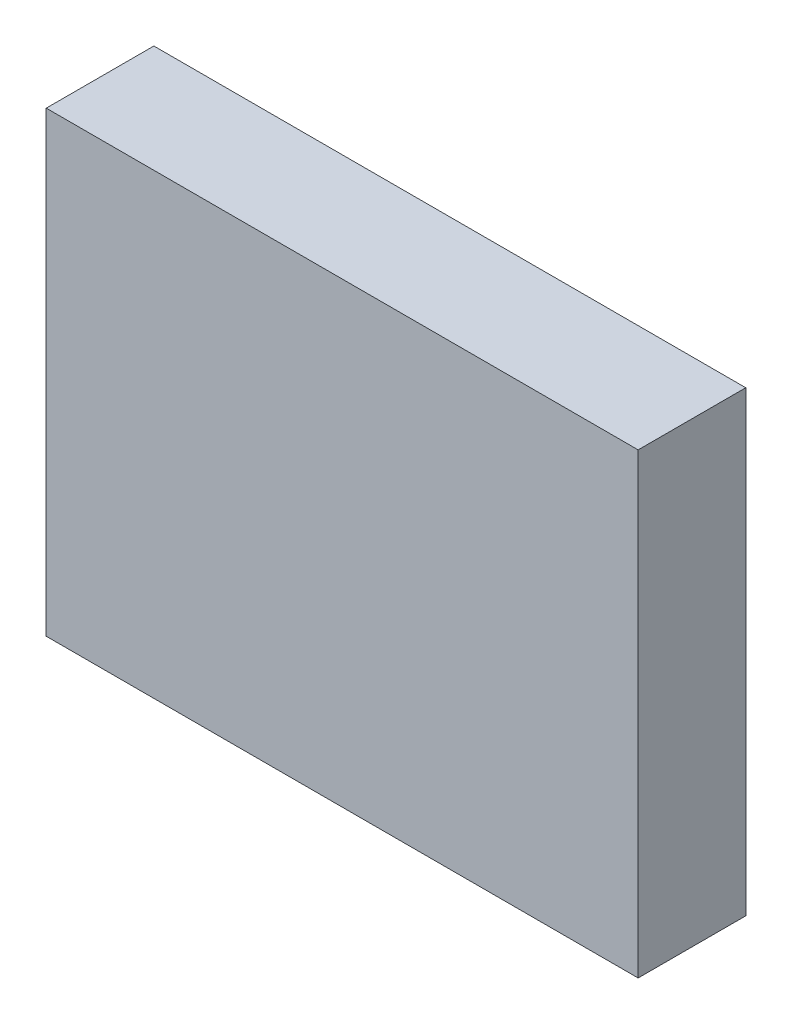
ISO-10303-21;
HEADER;
FILE_DESCRIPTION(('STEP AP214'),'2;1');
FILE_NAME('part.step','',(''),(''),'','','');
FILE_SCHEMA(('AUTOMOTIVE_DESIGN { 1 0 10303 214 1 1 1 1 }'));
ENDSEC;
DATA;
#1=APPLICATION_CONTEXT('core data for automotive mechanical design processes');
#2=APPLICATION_PROTOCOL_DEFINITION('international standard','automotive_design',2000,#1);
#3=PRODUCT_CONTEXT('',#1,'mechanical');
#4=PRODUCT('Part','Part','',(#3));
#5=PRODUCT_RELATED_PRODUCT_CATEGORY('part','',(#4));
#6=PRODUCT_DEFINITION_FORMATION('','',#4);
#7=PRODUCT_DEFINITION_CONTEXT('part definition',#1,'design');
#8=PRODUCT_DEFINITION('design','',#6,#7);
#9=PRODUCT_DEFINITION_SHAPE('','',#8);
#10=(LENGTH_UNIT() NAMED_UNIT(*) SI_UNIT(.MILLI.,.METRE.));
#11=(NAMED_UNIT(*) PLANE_ANGLE_UNIT() SI_UNIT($,.RADIAN.));
#12=(NAMED_UNIT(*) SI_UNIT($,.STERADIAN.) SOLID_ANGLE_UNIT());
#13=UNCERTAINTY_MEASURE_WITH_UNIT(LENGTH_MEASURE(1.E-05),#10,'distance_accuracy_value','');
#14=(GEOMETRIC_REPRESENTATION_CONTEXT(3) GLOBAL_UNCERTAINTY_ASSIGNED_CONTEXT((#13)) GLOBAL_UNIT_ASSIGNED_CONTEXT((#10,
#11,#12)) REPRESENTATION_CONTEXT('',''));
#15=CARTESIAN_POINT('',(0.,0.,0.));
#16=DIRECTION('',(0.,0.,1.));
#17=DIRECTION('',(1.,0.,0.));
#18=AXIS2_PLACEMENT_3D('',#15,#16,#17);
#19=CARTESIAN_POINT('',(0.,0.,4.));
#20=DIRECTION('',(1.,0.,0.));
#21=DIRECTION('',(0.,0.,-1.));
#22=AXIS2_PLACEMENT_3D('',#19,#20,#21);
#23=PLANE('',#22);
#24=DIRECTION('',(0.,-1.,0.));
#25=VECTOR('',#24,1.);
#26=CARTESIAN_POINT('',(0.,0.,0.));
#27=LINE('',#26,#25);
#28=CARTESIAN_POINT('',(0.,17.,0.));
#29=VERTEX_POINT('',#28);
#30=CARTESIAN_POINT('',(0.,0.,0.));
#31=VERTEX_POINT('',#30);
#32=EDGE_CURVE('E104',#29,#31,#27,.T.);
#33=ORIENTED_EDGE('',*,*,#32,.T.);
#34=DIRECTION('',(0.,0.,-1.));
#35=VECTOR('',#34,1.);
#36=CARTESIAN_POINT('',(0.,0.,4.));
#37=LINE('',#36,#35);
#38=CARTESIAN_POINT('',(0.,0.,4.));
#39=VERTEX_POINT('',#38);
#40=EDGE_CURVE('E11',#39,#31,#37,.T.);
#41=ORIENTED_EDGE('',*,*,#40,.F.);
#42=DIRECTION('',(0.,-1.,0.));
#43=VECTOR('',#42,1.);
#44=CARTESIAN_POINT('',(0.,0.,4.));
#45=LINE('',#44,#43);
#46=CARTESIAN_POINT('',(0.,17.,4.));
#47=VERTEX_POINT('',#46);
#48=EDGE_CURVE('E92',#47,#39,#45,.T.);
#49=ORIENTED_EDGE('',*,*,#48,.F.);
#50=DIRECTION('',(0.,0.,-1.));
#51=VECTOR('',#50,1.);
#52=CARTESIAN_POINT('',(0.,17.,4.));
#53=LINE('',#52,#51);
#54=EDGE_CURVE('E100',#47,#29,#53,.T.);
#55=ORIENTED_EDGE('',*,*,#54,.T.);
#56=EDGE_LOOP('',(#33,#41,#49,#55));
#57=FACE_BOUND('',#56,.T.);
#58=ADVANCED_FACE('F41',(#57),#23,.F.);
#59=CARTESIAN_POINT('',(0.,0.,4.));
#60=DIRECTION('',(0.,1.,0.));
#61=DIRECTION('',(0.,0.,1.));
#62=AXIS2_PLACEMENT_3D('',#59,#60,#61);
#63=PLANE('',#62);
#64=DIRECTION('',(1.,0.,0.));
#65=VECTOR('',#64,1.);
#66=CARTESIAN_POINT('',(0.,0.,0.));
#67=LINE('',#66,#65);
#68=CARTESIAN_POINT('',(22.,0.,0.));
#69=VERTEX_POINT('',#68);
#70=EDGE_CURVE('E96',#31,#69,#67,.T.);
#71=ORIENTED_EDGE('',*,*,#70,.T.);
#72=DIRECTION('',(0.,0.,-1.));
#73=VECTOR('',#72,1.);
#74=CARTESIAN_POINT('',(22.,0.,4.));
#75=LINE('',#74,#73);
#76=CARTESIAN_POINT('',(22.,0.,4.));
#77=VERTEX_POINT('',#76);
#78=EDGE_CURVE('E49',#77,#69,#75,.T.);
#79=ORIENTED_EDGE('',*,*,#78,.F.);
#80=DIRECTION('',(1.,0.,0.));
#81=VECTOR('',#80,1.);
#82=CARTESIAN_POINT('',(0.,0.,4.));
#83=LINE('',#82,#81);
#84=EDGE_CURVE('E87',#39,#77,#83,.T.);
#85=ORIENTED_EDGE('',*,*,#84,.F.);
#86=ORIENTED_EDGE('',*,*,#40,.T.);
#87=EDGE_LOOP('',(#71,#79,#85,#86));
#88=FACE_BOUND('',#87,.T.);
#89=ADVANCED_FACE('F95',(#88),#63,.F.);
#90=CARTESIAN_POINT('',(22.,0.,4.));
#91=DIRECTION('',(-1.,0.,0.));
#92=DIRECTION('',(0.,0.,1.));
#93=AXIS2_PLACEMENT_3D('',#90,#91,#92);
#94=PLANE('',#93);
#95=DIRECTION('',(0.,1.,0.));
#96=VECTOR('',#95,1.);
#97=CARTESIAN_POINT('',(22.,0.,0.));
#98=LINE('',#97,#96);
#99=CARTESIAN_POINT('',(22.,17.,0.));
#100=VERTEX_POINT('',#99);
#101=EDGE_CURVE('E74',#69,#100,#98,.T.);
#102=ORIENTED_EDGE('',*,*,#101,.T.);
#103=DIRECTION('',(0.,0.,-1.));
#104=VECTOR('',#103,1.);
#105=CARTESIAN_POINT('',(22.,17.,4.));
#106=LINE('',#105,#104);
#107=CARTESIAN_POINT('',(22.,17.,4.));
#108=VERTEX_POINT('',#107);
#109=EDGE_CURVE('E97',#108,#100,#106,.T.);
#110=ORIENTED_EDGE('',*,*,#109,.F.);
#111=DIRECTION('',(0.,1.,0.));
#112=VECTOR('',#111,1.);
#113=CARTESIAN_POINT('',(22.,0.,4.));
#114=LINE('',#113,#112);
#115=EDGE_CURVE('E90',#77,#108,#114,.T.);
#116=ORIENTED_EDGE('',*,*,#115,.F.);
#117=ORIENTED_EDGE('',*,*,#78,.T.);
#118=EDGE_LOOP('',(#102,#110,#116,#117));
#119=FACE_BOUND('',#118,.T.);
#120=ADVANCED_FACE('F98',(#119),#94,.F.);
#121=CARTESIAN_POINT('',(0.,17.,4.));
#122=DIRECTION('',(0.,-1.,0.));
#123=DIRECTION('',(0.,0.,-1.));
#124=AXIS2_PLACEMENT_3D('',#121,#122,#123);
#125=PLANE('',#124);
#126=DIRECTION('',(-1.,0.,0.));
#127=VECTOR('',#126,1.);
#128=CARTESIAN_POINT('',(0.,17.,0.));
#129=LINE('',#128,#127);
#130=EDGE_CURVE('E80',#100,#29,#129,.T.);
#131=ORIENTED_EDGE('',*,*,#130,.T.);
#132=ORIENTED_EDGE('',*,*,#54,.F.);
#133=DIRECTION('',(-1.,0.,0.));
#134=VECTOR('',#133,1.);
#135=CARTESIAN_POINT('',(0.,17.,4.));
#136=LINE('',#135,#134);
#137=EDGE_CURVE('E57',#108,#47,#136,.T.);
#138=ORIENTED_EDGE('',*,*,#137,.F.);
#139=ORIENTED_EDGE('',*,*,#109,.T.);
#140=EDGE_LOOP('',(#131,#132,#138,#139));
#141=FACE_BOUND('',#140,.T.);
#142=ADVANCED_FACE('F111',(#141),#125,.F.);
#143=CARTESIAN_POINT('',(0.,0.,4.));
#144=DIRECTION('',(0.,0.,-1.));
#145=DIRECTION('',(-1.,0.,0.));
#146=AXIS2_PLACEMENT_3D('',#143,#144,#145);
#147=PLANE('',#146);
#148=ORIENTED_EDGE('',*,*,#48,.T.);
#149=ORIENTED_EDGE('',*,*,#84,.T.);
#150=ORIENTED_EDGE('',*,*,#115,.T.);
#151=ORIENTED_EDGE('',*,*,#137,.T.);
#152=EDGE_LOOP('',(#148,#149,#150,#151));
#153=FACE_BOUND('',#152,.T.);
#154=ADVANCED_FACE('F88',(#153),#147,.F.);
#155=CARTESIAN_POINT('',(0.,0.,0.));
#156=DIRECTION('',(0.,0.,-1.));
#157=DIRECTION('',(-1.,0.,0.));
#158=AXIS2_PLACEMENT_3D('',#155,#156,#157);
#159=PLANE('',#158);
#160=ORIENTED_EDGE('',*,*,#32,.F.);
#161=ORIENTED_EDGE('',*,*,#130,.F.);
#162=ORIENTED_EDGE('',*,*,#101,.F.);
#163=ORIENTED_EDGE('',*,*,#70,.F.);
#164=EDGE_LOOP('',(#160,#161,#162,#163));
#165=FACE_BOUND('',#164,.T.);
#166=ADVANCED_FACE('F114',(#165),#159,.T.);
#167=CLOSED_SHELL('',(#58,#89,#120,#142,#154,#166));
#168=MANIFOLD_SOLID_BREP('B2',#167);
#169=ADVANCED_BREP_SHAPE_REPRESENTATION('',(#18,#168),#14);
#170=SHAPE_DEFINITION_REPRESENTATION(#9,#169);
ENDSEC;
END-ISO-10303-21;
